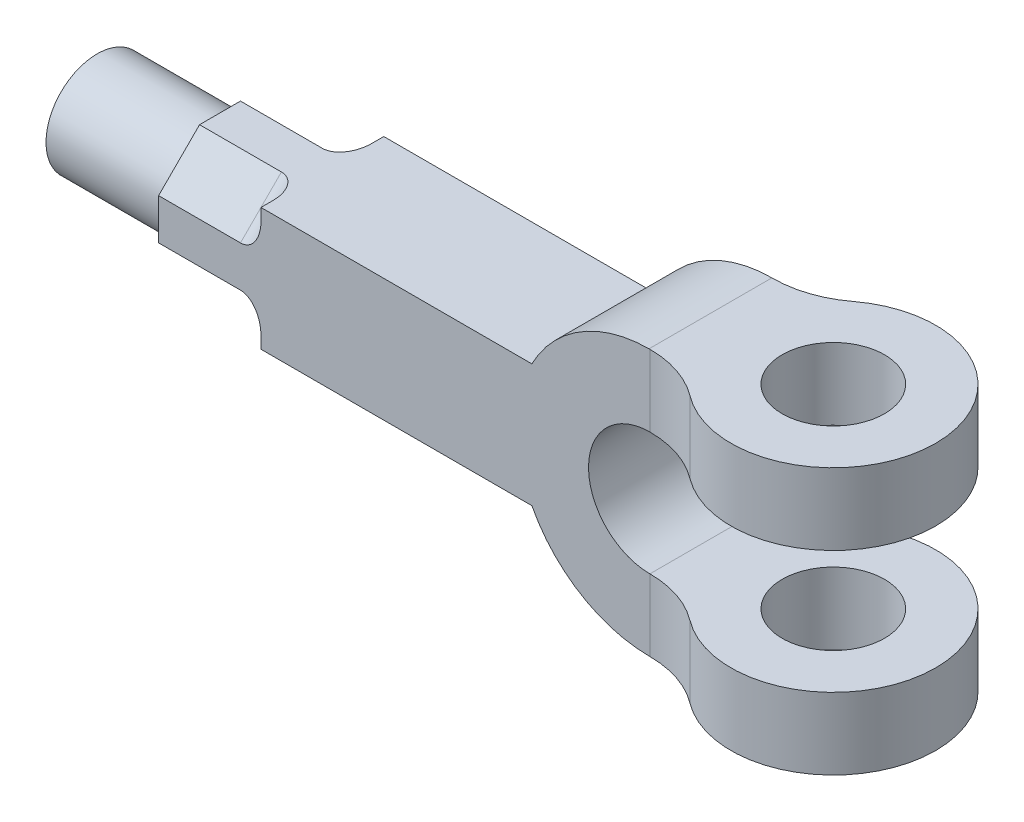
ISO-10303-21;
HEADER;
FILE_DESCRIPTION(('STEP AP214'),'2;1');
FILE_NAME('part.step','',(''),(''),'','','');
FILE_SCHEMA(('AUTOMOTIVE_DESIGN { 1 0 10303 214 1 1 1 1 }'));
ENDSEC;
DATA;
#1=APPLICATION_CONTEXT('core data for automotive mechanical design processes');
#2=APPLICATION_PROTOCOL_DEFINITION('international standard','automotive_design',2000,#1);
#3=PRODUCT_CONTEXT('',#1,'mechanical');
#4=PRODUCT('Part','Part','',(#3));
#5=PRODUCT_RELATED_PRODUCT_CATEGORY('part','',(#4));
#6=PRODUCT_DEFINITION_FORMATION('','',#4);
#7=PRODUCT_DEFINITION_CONTEXT('part definition',#1,'design');
#8=PRODUCT_DEFINITION('design','',#6,#7);
#9=PRODUCT_DEFINITION_SHAPE('','',#8);
#10=(LENGTH_UNIT() NAMED_UNIT(*) SI_UNIT(.MILLI.,.METRE.));
#11=(NAMED_UNIT(*) PLANE_ANGLE_UNIT() SI_UNIT($,.RADIAN.));
#12=(NAMED_UNIT(*) SI_UNIT($,.STERADIAN.) SOLID_ANGLE_UNIT());
#13=UNCERTAINTY_MEASURE_WITH_UNIT(LENGTH_MEASURE(1.E-05),#10,'distance_accuracy_value','');
#14=(GEOMETRIC_REPRESENTATION_CONTEXT(3) GLOBAL_UNCERTAINTY_ASSIGNED_CONTEXT((#13)) GLOBAL_UNIT_ASSIGNED_CONTEXT((#10,
#11,#12)) REPRESENTATION_CONTEXT('',''));
#15=CARTESIAN_POINT('',(0.,0.,0.));
#16=DIRECTION('',(0.,0.,1.));
#17=DIRECTION('',(1.,0.,0.));
#18=AXIS2_PLACEMENT_3D('',#15,#16,#17);
#19=CARTESIAN_POINT('',(-23.832750575626,14.,31.5));
#20=DIRECTION('',(0.,-1.,0.));
#21=DIRECTION('',(0.,0.,-1.));
#22=AXIS2_PLACEMENT_3D('',#19,#20,#21);
#23=CYLINDRICAL_SURFACE('',#22,19.5);
#24=CARTESIAN_POINT('',(-23.832750575626,0.,31.5));
#25=DIRECTION('',(0.,-1.,0.));
#26=DIRECTION('',(0.,0.,1.));
#27=AXIS2_PLACEMENT_3D('',#24,#25,#26);
#28=CIRCLE('',#27,19.5);
#29=CARTESIAN_POINT('',(-23.832750575626,0.,12.));
#30=VERTEX_POINT('',#29);
#31=CARTESIAN_POINT('',(-12.0672154813296,0.,15.9493670886076));
#32=VERTEX_POINT('',#31);
#33=EDGE_CURVE('E370',#30,#32,#28,.T.);
#34=ORIENTED_EDGE('',*,*,#33,.T.);
#35=DIRECTION('',(0.,-1.,0.));
#36=VECTOR('',#35,1.);
#37=CARTESIAN_POINT('',(-12.0672154813296,14.,15.9493670886076));
#38=LINE('',#37,#36);
#39=CARTESIAN_POINT('',(-12.0672154813296,14.,15.9493670886076));
#40=VERTEX_POINT('',#39);
#41=EDGE_CURVE('E406',#40,#32,#38,.T.);
#42=ORIENTED_EDGE('',*,*,#41,.F.);
#43=CARTESIAN_POINT('',(-23.832750575626,14.,31.5));
#44=DIRECTION('',(0.,-1.,0.));
#45=DIRECTION('',(0.,0.,1.));
#46=AXIS2_PLACEMENT_3D('',#43,#44,#45);
#47=CIRCLE('',#46,19.5);
#48=CARTESIAN_POINT('',(-23.832750575626,14.,12.));
#49=VERTEX_POINT('',#48);
#50=EDGE_CURVE('E371',#49,#40,#47,.T.);
#51=ORIENTED_EDGE('',*,*,#50,.F.);
#52=DIRECTION('',(0.,-1.,0.));
#53=VECTOR('',#52,1.);
#54=CARTESIAN_POINT('',(-23.832750575626,14.,12.));
#55=LINE('',#54,#53);
#56=EDGE_CURVE('E385',#49,#30,#55,.T.);
#57=ORIENTED_EDGE('',*,*,#56,.T.);
#58=EDGE_LOOP('',(#34,#42,#51,#57));
#59=FACE_BOUND('',#58,.T.);
#60=ADVANCED_FACE('F32',(#59),#23,.F.);
#61=CARTESIAN_POINT('',(0.,14.,0.));
#62=DIRECTION('',(0.,-1.,0.));
#63=DIRECTION('',(0.,0.,-1.));
#64=AXIS2_PLACEMENT_3D('',#61,#62,#63);
#65=CYLINDRICAL_SURFACE('',#64,20.);
#66=CARTESIAN_POINT('',(0.,0.,0.));
#67=DIRECTION('',(0.,1.,0.));
#68=DIRECTION('',(0.,0.,1.));
#69=AXIS2_PLACEMENT_3D('',#66,#67,#68);
#70=CIRCLE('',#69,20.);
#71=CARTESIAN_POINT('',(-12.0672154813296,0.,-15.9493670886076));
#72=VERTEX_POINT('',#71);
#73=EDGE_CURVE('E388',#32,#72,#70,.T.);
#74=ORIENTED_EDGE('',*,*,#73,.T.);
#75=DIRECTION('',(0.,-1.,0.));
#76=VECTOR('',#75,1.);
#77=CARTESIAN_POINT('',(-12.0672154813296,14.,-15.9493670886076));
#78=LINE('',#77,#76);
#79=CARTESIAN_POINT('',(-12.0672154813296,14.,-15.9493670886076));
#80=VERTEX_POINT('',#79);
#81=EDGE_CURVE('E403',#80,#72,#78,.T.);
#82=ORIENTED_EDGE('',*,*,#81,.F.);
#83=CARTESIAN_POINT('',(0.,14.,0.));
#84=DIRECTION('',(0.,1.,0.));
#85=DIRECTION('',(0.,0.,1.));
#86=AXIS2_PLACEMENT_3D('',#83,#84,#85);
#87=CIRCLE('',#86,20.);
#88=EDGE_CURVE('E374',#40,#80,#87,.T.);
#89=ORIENTED_EDGE('',*,*,#88,.F.);
#90=ORIENTED_EDGE('',*,*,#41,.T.);
#91=EDGE_LOOP('',(#74,#82,#89,#90));
#92=FACE_BOUND('',#91,.T.);
#93=ADVANCED_FACE('F542',(#92),#65,.T.);
#94=CARTESIAN_POINT('',(-23.832750575626,14.,-31.5));
#95=DIRECTION('',(0.,-1.,0.));
#96=DIRECTION('',(0.,0.,-1.));
#97=AXIS2_PLACEMENT_3D('',#94,#95,#96);
#98=CYLINDRICAL_SURFACE('',#97,19.5);
#99=CARTESIAN_POINT('',(-23.832750575626,0.,-31.5));
#100=DIRECTION('',(0.,-1.,0.));
#101=DIRECTION('',(0.,0.,-1.));
#102=AXIS2_PLACEMENT_3D('',#99,#100,#101);
#103=CIRCLE('',#102,19.5);
#104=CARTESIAN_POINT('',(-23.832750575626,0.,-12.));
#105=VERTEX_POINT('',#104);
#106=EDGE_CURVE('E375',#72,#105,#103,.T.);
#107=ORIENTED_EDGE('',*,*,#106,.T.);
#108=DIRECTION('',(0.,-1.,0.));
#109=VECTOR('',#108,1.);
#110=CARTESIAN_POINT('',(-23.832750575626,14.,-12.));
#111=LINE('',#110,#109);
#112=CARTESIAN_POINT('',(-23.832750575626,14.,-12.));
#113=VERTEX_POINT('',#112);
#114=EDGE_CURVE('E400',#113,#105,#111,.T.);
#115=ORIENTED_EDGE('',*,*,#114,.F.);
#116=CARTESIAN_POINT('',(-23.832750575626,14.,-31.5));
#117=DIRECTION('',(0.,-1.,0.));
#118=DIRECTION('',(0.,0.,-1.));
#119=AXIS2_PLACEMENT_3D('',#116,#117,#118);
#120=CIRCLE('',#119,19.5);
#121=EDGE_CURVE('E377',#80,#113,#120,.T.);
#122=ORIENTED_EDGE('',*,*,#121,.F.);
#123=ORIENTED_EDGE('',*,*,#81,.T.);
#124=EDGE_LOOP('',(#107,#115,#122,#123));
#125=FACE_BOUND('',#124,.T.);
#126=ADVANCED_FACE('F498',(#125),#98,.F.);
#127=CARTESIAN_POINT('',(-24.,14.,-12.));
#128=DIRECTION('',(0.,0.,1.));
#129=DIRECTION('',(1.,0.,0.));
#130=AXIS2_PLACEMENT_3D('',#127,#128,#129);
#131=PLANE('',#130);
#132=DIRECTION('',(0.,1.,0.));
#133=VECTOR('',#132,1.);
#134=CARTESIAN_POINT('',(-24.,-38.,-12.));
#135=LINE('',#134,#133);
#136=CARTESIAN_POINT('',(-24.,-38.,-12.));
#137=VERTEX_POINT('',#136);
#138=CARTESIAN_POINT('',(-24.,-37.9994620642437,-12.));
#139=VERTEX_POINT('',#138);
#140=EDGE_CURVE('E224',#137,#139,#135,.T.);
#141=ORIENTED_EDGE('',*,*,#140,.T.);
#142=CARTESIAN_POINT('',(-23.832750575626,-12.,-12.));
#143=DIRECTION('',(0.,0.,1.));
#144=DIRECTION('',(1.,0.,0.));
#145=AXIS2_PLACEMENT_3D('',#142,#143,#144);
#146=CIRCLE('',#145,26.);
#147=CARTESIAN_POINT('',(-46.8978757649676,-24.,-12.));
#148=VERTEX_POINT('',#147);
#149=EDGE_CURVE('E48',#148,#139,#146,.T.);
#150=ORIENTED_EDGE('',*,*,#149,.F.);
#151=DIRECTION('',(1.,0.,0.));
#152=VECTOR('',#151,1.);
#153=CARTESIAN_POINT('',(-46.8978757649676,-24.,-12.));
#154=LINE('',#153,#152);
#155=CARTESIAN_POINT('',(-99.832750575626,-23.9999999999998,-11.9999999999999));
#156=VERTEX_POINT('',#155);
#157=EDGE_CURVE('E343',#156,#148,#154,.T.);
#158=ORIENTED_EDGE('',*,*,#157,.F.);
#159=DIRECTION('',(0.,-1.,0.));
#160=VECTOR('',#159,1.);
#161=CARTESIAN_POINT('',(-99.832750575626,-23.9999999999998,-11.9999999999999));
#162=LINE('',#161,#160);
#163=CARTESIAN_POINT('',(-99.832750575626,-21.6568542494921,-11.9999999999999));
#164=VERTEX_POINT('',#163);
#165=EDGE_CURVE('E300',#164,#156,#162,.T.);
#166=ORIENTED_EDGE('',*,*,#165,.F.);
#167=CARTESIAN_POINT('',(-103.832750575626,-21.656854249492,-12.));
#168=DIRECTION('',(0.,0.,1.));
#169=DIRECTION('',(0.,1.,0.));
#170=AXIS2_PLACEMENT_3D('',#167,#168,#169);
#171=ELLIPSE('',#170,5.65685424949244,4.);
#172=CARTESIAN_POINT('',(-103.832750575626,-15.9999999999998,-11.9999999999998));
#173=VERTEX_POINT('',#172);
#174=EDGE_CURVE('E437',#164,#173,#171,.T.);
#175=ORIENTED_EDGE('',*,*,#174,.T.);
#176=DIRECTION('',(-1.,0.,0.));
#177=VECTOR('',#176,1.);
#178=CARTESIAN_POINT('',(-99.832750575626,-15.9999999999998,-11.9999999999998));
#179=LINE('',#178,#177);
#180=CARTESIAN_POINT('',(-119.832750575626,-15.9999999999998,-11.9999999999998));
#181=VERTEX_POINT('',#180);
#182=EDGE_CURVE('E294',#173,#181,#179,.T.);
#183=ORIENTED_EDGE('',*,*,#182,.T.);
#184=DIRECTION('',(0.,-1.,0.));
#185=VECTOR('',#184,1.);
#186=CARTESIAN_POINT('',(-119.832750575626,-24.,-12.));
#187=LINE('',#186,#185);
#188=CARTESIAN_POINT('',(-119.832750575626,-8.00000000000001,-12.));
#189=VERTEX_POINT('',#188);
#190=EDGE_CURVE('E340',#189,#181,#187,.T.);
#191=ORIENTED_EDGE('',*,*,#190,.F.);
#192=DIRECTION('',(-1.,0.,0.));
#193=VECTOR('',#192,1.);
#194=CARTESIAN_POINT('',(-99.832750575626,-8.00000000000001,-12.));
#195=LINE('',#194,#193);
#196=CARTESIAN_POINT('',(-103.832750575626,-8.00000000000001,-12.));
#197=VERTEX_POINT('',#196);
#198=EDGE_CURVE('E312',#197,#189,#195,.T.);
#199=ORIENTED_EDGE('',*,*,#198,.F.);
#200=CARTESIAN_POINT('',(-103.832750575626,-2.34314575050762,-12.));
#201=DIRECTION('',(0.,0.,1.));
#202=DIRECTION('',(0.,1.,0.));
#203=AXIS2_PLACEMENT_3D('',#200,#201,#202);
#204=ELLIPSE('',#203,5.65685424949238,4.);
#205=CARTESIAN_POINT('',(-99.832750575626,-2.34314575050763,-12.));
#206=VERTEX_POINT('',#205);
#207=EDGE_CURVE('E270',#197,#206,#204,.T.);
#208=ORIENTED_EDGE('',*,*,#207,.T.);
#209=DIRECTION('',(0.,-1.,0.));
#210=VECTOR('',#209,1.);
#211=CARTESIAN_POINT('',(-99.832750575626,0.,-12.));
#212=LINE('',#211,#210);
#213=CARTESIAN_POINT('',(-99.832750575626,0.,-12.));
#214=VERTEX_POINT('',#213);
#215=EDGE_CURVE('E307',#214,#206,#212,.T.);
#216=ORIENTED_EDGE('',*,*,#215,.F.);
#217=DIRECTION('',(-1.,0.,0.));
#218=VECTOR('',#217,1.);
#219=CARTESIAN_POINT('',(-46.8978757649676,0.,-12.));
#220=LINE('',#219,#218);
#221=CARTESIAN_POINT('',(-46.8978757649676,0.,-12.));
#222=VERTEX_POINT('',#221);
#223=EDGE_CURVE('E337',#222,#214,#220,.T.);
#224=ORIENTED_EDGE('',*,*,#223,.F.);
#225=CARTESIAN_POINT('',(-23.832750575626,-12.,-12.));
#226=DIRECTION('',(0.,0.,1.));
#227=DIRECTION('',(1.,0.,0.));
#228=AXIS2_PLACEMENT_3D('',#225,#226,#227);
#229=CIRCLE('',#228,26.);
#230=CARTESIAN_POINT('',(-24.,13.9994620642437,-12.));
#231=VERTEX_POINT('',#230);
#232=EDGE_CURVE('E335',#231,#222,#229,.T.);
#233=ORIENTED_EDGE('',*,*,#232,.F.);
#234=DIRECTION('',(0.,-1.,0.));
#235=VECTOR('',#234,1.);
#236=CARTESIAN_POINT('',(-24.,14.,-12.));
#237=LINE('',#236,#235);
#238=CARTESIAN_POINT('',(-24.,14.,-12.));
#239=VERTEX_POINT('',#238);
#240=EDGE_CURVE('E397',#239,#231,#237,.T.);
#241=ORIENTED_EDGE('',*,*,#240,.F.);
#242=DIRECTION('',(-1.,0.,0.));
#243=VECTOR('',#242,1.);
#244=CARTESIAN_POINT('',(-24.,14.,-12.));
#245=LINE('',#244,#243);
#246=EDGE_CURVE('E379',#113,#239,#245,.T.);
#247=ORIENTED_EDGE('',*,*,#246,.F.);
#248=ORIENTED_EDGE('',*,*,#114,.T.);
#249=CARTESIAN_POINT('',(-23.832750575626,-12.,-12.));
#250=DIRECTION('',(0.,0.,-1.));
#251=DIRECTION('',(1.,0.,0.));
#252=AXIS2_PLACEMENT_3D('',#249,#250,#251);
#253=CIRCLE('',#252,12.);
#254=CARTESIAN_POINT('',(-23.832750575626,-24.,-12.));
#255=VERTEX_POINT('',#254);
#256=EDGE_CURVE('E333',#255,#105,#253,.T.);
#257=ORIENTED_EDGE('',*,*,#256,.F.);
#258=DIRECTION('',(0.,1.,0.));
#259=VECTOR('',#258,1.);
#260=CARTESIAN_POINT('',(-23.832750575626,-24.,-12.));
#261=LINE('',#260,#259);
#262=CARTESIAN_POINT('',(-23.832750575626,-38.,-12.));
#263=VERTEX_POINT('',#262);
#264=EDGE_CURVE('E346',#263,#255,#261,.T.);
#265=ORIENTED_EDGE('',*,*,#264,.F.);
#266=DIRECTION('',(-1.,0.,0.));
#267=VECTOR('',#266,1.);
#268=CARTESIAN_POINT('',(-24.,-38.,-12.));
#269=LINE('',#268,#267);
#270=EDGE_CURVE('E239',#263,#137,#269,.T.);
#271=ORIENTED_EDGE('',*,*,#270,.T.);
#272=EDGE_LOOP('',(#141,#150,#158,#166,#175,#183,#191,#199,#208,#216,#224,#233,#241,#247,#248,
#257,#265,#271));
#273=FACE_BOUND('',#272,.T.);
#274=ADVANCED_FACE('F447',(#273),#131,.F.);
#275=CARTESIAN_POINT('',(-24.,14.,-12.));
#276=DIRECTION('',(1.,0.,0.));
#277=DIRECTION('',(0.,0.,-1.));
#278=AXIS2_PLACEMENT_3D('',#275,#276,#277);
#279=PLANE('',#278);
#280=ORIENTED_EDGE('',*,*,#240,.T.);
#281=DIRECTION('',(0.,0.,1.));
#282=VECTOR('',#281,1.);
#283=CARTESIAN_POINT('',(-24.,13.9994620642437,-12.));
#284=LINE('',#283,#282);
#285=CARTESIAN_POINT('',(-24.,13.9994620642437,12.));
#286=VERTEX_POINT('',#285);
#287=EDGE_CURVE('E353',#231,#286,#284,.T.);
#288=ORIENTED_EDGE('',*,*,#287,.T.);
#289=DIRECTION('',(0.,-1.,0.));
#290=VECTOR('',#289,1.);
#291=CARTESIAN_POINT('',(-24.,14.,12.));
#292=LINE('',#291,#290);
#293=CARTESIAN_POINT('',(-24.,14.,12.));
#294=VERTEX_POINT('',#293);
#295=EDGE_CURVE('E394',#294,#286,#292,.T.);
#296=ORIENTED_EDGE('',*,*,#295,.F.);
#297=DIRECTION('',(0.,0.,1.));
#298=VECTOR('',#297,1.);
#299=CARTESIAN_POINT('',(-24.,14.,-12.));
#300=LINE('',#299,#298);
#301=EDGE_CURVE('E381',#239,#294,#300,.T.);
#302=ORIENTED_EDGE('',*,*,#301,.F.);
#303=EDGE_LOOP('',(#280,#288,#296,#302));
#304=FACE_BOUND('',#303,.T.);
#305=ADVANCED_FACE('F488',(#304),#279,.F.);
#306=CARTESIAN_POINT('',(-24.,14.,12.));
#307=DIRECTION('',(0.,0.,-1.));
#308=DIRECTION('',(-1.,0.,0.));
#309=AXIS2_PLACEMENT_3D('',#306,#307,#308);
#310=PLANE('',#309);
#311=CARTESIAN_POINT('',(-23.832750575626,-12.,12.));
#312=DIRECTION('',(0.,0.,1.));
#313=DIRECTION('',(1.,0.,0.));
#314=AXIS2_PLACEMENT_3D('',#311,#312,#313);
#315=CIRCLE('',#314,26.);
#316=CARTESIAN_POINT('',(-46.8978757649676,-24.,12.));
#317=VERTEX_POINT('',#316);
#318=CARTESIAN_POINT('',(-24.,-37.9994620642437,12.));
#319=VERTEX_POINT('',#318);
#320=EDGE_CURVE('E220',#317,#319,#315,.T.);
#321=ORIENTED_EDGE('',*,*,#320,.T.);
#322=DIRECTION('',(0.,1.,0.));
#323=VECTOR('',#322,1.);
#324=CARTESIAN_POINT('',(-24.,-38.,12.));
#325=LINE('',#324,#323);
#326=CARTESIAN_POINT('',(-24.,-38.,12.));
#327=VERTEX_POINT('',#326);
#328=EDGE_CURVE('E216',#327,#319,#325,.T.);
#329=ORIENTED_EDGE('',*,*,#328,.F.);
#330=DIRECTION('',(1.,0.,0.));
#331=VECTOR('',#330,1.);
#332=CARTESIAN_POINT('',(-24.,-38.,12.));
#333=LINE('',#332,#331);
#334=CARTESIAN_POINT('',(-23.832750575626,-38.,12.));
#335=VERTEX_POINT('',#334);
#336=EDGE_CURVE('E219',#327,#335,#333,.T.);
#337=ORIENTED_EDGE('',*,*,#336,.T.);
#338=DIRECTION('',(0.,1.,0.));
#339=VECTOR('',#338,1.);
#340=CARTESIAN_POINT('',(-23.832750575626,-24.,12.));
#341=LINE('',#340,#339);
#342=CARTESIAN_POINT('',(-23.832750575626,-24.,12.));
#343=VERTEX_POINT('',#342);
#344=EDGE_CURVE('E331',#335,#343,#341,.T.);
#345=ORIENTED_EDGE('',*,*,#344,.T.);
#346=CARTESIAN_POINT('',(-23.832750575626,-12.,12.));
#347=DIRECTION('',(0.,0.,-1.));
#348=DIRECTION('',(1.,0.,0.));
#349=AXIS2_PLACEMENT_3D('',#346,#347,#348);
#350=CIRCLE('',#349,12.);
#351=EDGE_CURVE('E317',#343,#30,#350,.T.);
#352=ORIENTED_EDGE('',*,*,#351,.T.);
#353=ORIENTED_EDGE('',*,*,#56,.F.);
#354=DIRECTION('',(1.,0.,0.));
#355=VECTOR('',#354,1.);
#356=CARTESIAN_POINT('',(-24.,14.,12.));
#357=LINE('',#356,#355);
#358=EDGE_CURVE('E383',#294,#49,#357,.T.);
#359=ORIENTED_EDGE('',*,*,#358,.F.);
#360=ORIENTED_EDGE('',*,*,#295,.T.);
#361=CARTESIAN_POINT('',(-23.832750575626,-12.,12.));
#362=DIRECTION('',(0.,0.,1.));
#363=DIRECTION('',(1.,0.,0.));
#364=AXIS2_PLACEMENT_3D('',#361,#362,#363);
#365=CIRCLE('',#364,26.);
#366=CARTESIAN_POINT('',(-46.8978757649676,0.,12.));
#367=VERTEX_POINT('',#366);
#368=EDGE_CURVE('E320',#286,#367,#365,.T.);
#369=ORIENTED_EDGE('',*,*,#368,.T.);
#370=DIRECTION('',(-1.,0.,0.));
#371=VECTOR('',#370,1.);
#372=CARTESIAN_POINT('',(-46.8978757649676,0.,12.));
#373=LINE('',#372,#371);
#374=CARTESIAN_POINT('',(-99.832750575626,0.,12.));
#375=VERTEX_POINT('',#374);
#376=EDGE_CURVE('E322',#367,#375,#373,.T.);
#377=ORIENTED_EDGE('',*,*,#376,.T.);
#378=DIRECTION('',(0.,1.,0.));
#379=VECTOR('',#378,1.);
#380=CARTESIAN_POINT('',(-99.832750575626,1.96023752785379E-13,11.9999999999999));
#381=LINE('',#380,#379);
#382=CARTESIAN_POINT('',(-99.832750575626,-2.34314575050742,11.9999999999999));
#383=VERTEX_POINT('',#382);
#384=EDGE_CURVE('E274',#383,#375,#381,.T.);
#385=ORIENTED_EDGE('',*,*,#384,.F.);
#386=CARTESIAN_POINT('',(-103.832750575626,-2.34314575050752,12.));
#387=DIRECTION('',(0.,0.,-1.));
#388=DIRECTION('',(0.,-1.,0.));
#389=AXIS2_PLACEMENT_3D('',#386,#387,#388);
#390=ELLIPSE('',#389,5.6568542494924,4.);
#391=CARTESIAN_POINT('',(-103.832750575626,-7.9999999999998,11.9999999999999));
#392=VERTEX_POINT('',#391);
#393=EDGE_CURVE('E429',#383,#392,#390,.T.);
#394=ORIENTED_EDGE('',*,*,#393,.T.);
#395=DIRECTION('',(-1.,0.,0.));
#396=VECTOR('',#395,1.);
#397=CARTESIAN_POINT('',(-99.832750575626,-7.9999999999998,11.9999999999999));
#398=LINE('',#397,#396);
#399=CARTESIAN_POINT('',(-119.832750575626,-7.9999999999998,11.9999999999999));
#400=VERTEX_POINT('',#399);
#401=EDGE_CURVE('E281',#392,#400,#398,.T.);
#402=ORIENTED_EDGE('',*,*,#401,.T.);
#403=DIRECTION('',(0.,-1.,0.));
#404=VECTOR('',#403,1.);
#405=CARTESIAN_POINT('',(-119.832750575626,-24.,12.));
#406=LINE('',#405,#404);
#407=CARTESIAN_POINT('',(-119.832750575626,-15.9999999999998,12.));
#408=VERTEX_POINT('',#407);
#409=EDGE_CURVE('E325',#400,#408,#406,.T.);
#410=ORIENTED_EDGE('',*,*,#409,.T.);
#411=DIRECTION('',(-1.,0.,0.));
#412=VECTOR('',#411,1.);
#413=CARTESIAN_POINT('',(-99.832750575626,-15.9999999999997,12.0000000000001));
#414=LINE('',#413,#412);
#415=CARTESIAN_POINT('',(-103.832750575626,-15.9999999999997,12.0000000000001));
#416=VERTEX_POINT('',#415);
#417=EDGE_CURVE('E291',#416,#408,#414,.T.);
#418=ORIENTED_EDGE('',*,*,#417,.F.);
#419=CARTESIAN_POINT('',(-103.832750575626,-21.6568542494921,12.));
#420=DIRECTION('',(0.,0.,-1.));
#421=DIRECTION('',(0.,-1.,0.));
#422=AXIS2_PLACEMENT_3D('',#419,#420,#421);
#423=ELLIPSE('',#422,5.65685424949234,4.);
#424=CARTESIAN_POINT('',(-99.832750575626,-21.6568542494921,12.));
#425=VERTEX_POINT('',#424);
#426=EDGE_CURVE('E435',#416,#425,#423,.T.);
#427=ORIENTED_EDGE('',*,*,#426,.T.);
#428=DIRECTION('',(0.,1.,0.));
#429=VECTOR('',#428,1.);
#430=CARTESIAN_POINT('',(-99.832750575626,-23.9999999999997,12.));
#431=LINE('',#430,#429);
#432=CARTESIAN_POINT('',(-99.832750575626,-23.9999999999997,12.));
#433=VERTEX_POINT('',#432);
#434=EDGE_CURVE('E285',#433,#425,#431,.T.);
#435=ORIENTED_EDGE('',*,*,#434,.F.);
#436=DIRECTION('',(1.,0.,0.));
#437=VECTOR('',#436,1.);
#438=CARTESIAN_POINT('',(-46.8978757649676,-24.,12.));
#439=LINE('',#438,#437);
#440=EDGE_CURVE('E328',#433,#317,#439,.T.);
#441=ORIENTED_EDGE('',*,*,#440,.T.);
#442=EDGE_LOOP('',(#321,#329,#337,#345,#352,#353,#359,#360,#369,#377,#385,#394,#402,#410,#418,
#427,#435,#441));
#443=FACE_BOUND('',#442,.T.);
#444=ADVANCED_FACE('F218',(#443),#310,.F.);
#445=CARTESIAN_POINT('',(-23.832750575626,14.,31.5));
#446=DIRECTION('',(0.,1.,0.));
#447=DIRECTION('',(0.,0.,1.));
#448=AXIS2_PLACEMENT_3D('',#445,#446,#447);
#449=PLANE('',#448);
#450=CARTESIAN_POINT('',(0.,14.,0.));
#451=DIRECTION('',(0.,1.,0.));
#452=DIRECTION('',(0.,0.,1.));
#453=AXIS2_PLACEMENT_3D('',#450,#451,#452);
#454=CIRCLE('',#453,10.);
#455=CARTESIAN_POINT('',(0.,14.,10.));
#456=VERTEX_POINT('',#455);
#457=EDGE_CURVE('E882',#456,#456,#454,.T.);
#458=ORIENTED_EDGE('',*,*,#457,.F.);
#459=EDGE_LOOP('',(#458));
#460=FACE_BOUND('',#459,.T.);
#461=ORIENTED_EDGE('',*,*,#121,.T.);
#462=ORIENTED_EDGE('',*,*,#246,.T.);
#463=ORIENTED_EDGE('',*,*,#301,.T.);
#464=ORIENTED_EDGE('',*,*,#358,.T.);
#465=ORIENTED_EDGE('',*,*,#50,.T.);
#466=ORIENTED_EDGE('',*,*,#88,.T.);
#467=EDGE_LOOP('',(#461,#462,#463,#464,#465,#466));
#468=FACE_BOUND('',#467,.T.);
#469=ADVANCED_FACE('F492',(#460,#468),#449,.T.);
#470=CARTESIAN_POINT('',(-23.832750575626,0.,31.5));
#471=DIRECTION('',(0.,1.,0.));
#472=DIRECTION('',(0.,0.,1.));
#473=AXIS2_PLACEMENT_3D('',#470,#471,#472);
#474=PLANE('',#473);
#475=CARTESIAN_POINT('',(0.,0.,0.));
#476=DIRECTION('',(0.,1.,0.));
#477=DIRECTION('',(0.,0.,1.));
#478=AXIS2_PLACEMENT_3D('',#475,#476,#477);
#479=CIRCLE('',#478,10.);
#480=CARTESIAN_POINT('',(0.,0.,10.));
#481=VERTEX_POINT('',#480);
#482=EDGE_CURVE('E255',#481,#481,#479,.T.);
#483=ORIENTED_EDGE('',*,*,#482,.T.);
#484=EDGE_LOOP('',(#483));
#485=FACE_BOUND('',#484,.T.);
#486=ORIENTED_EDGE('',*,*,#33,.F.);
#487=DIRECTION('',(0.,0.,1.));
#488=VECTOR('',#487,1.);
#489=CARTESIAN_POINT('',(-23.832750575626,0.,-12.));
#490=LINE('',#489,#488);
#491=EDGE_CURVE('E349',#105,#30,#490,.T.);
#492=ORIENTED_EDGE('',*,*,#491,.F.);
#493=ORIENTED_EDGE('',*,*,#106,.F.);
#494=ORIENTED_EDGE('',*,*,#73,.F.);
#495=EDGE_LOOP('',(#486,#492,#493,#494));
#496=FACE_BOUND('',#495,.T.);
#497=ADVANCED_FACE('F504',(#485,#496),#474,.F.);
#498=CARTESIAN_POINT('',(-23.832750575626,-12.,-12.));
#499=DIRECTION('',(0.,0.,1.));
#500=DIRECTION('',(1.,0.,0.));
#501=AXIS2_PLACEMENT_3D('',#498,#499,#500);
#502=CYLINDRICAL_SURFACE('',#501,26.);
#503=ORIENTED_EDGE('',*,*,#287,.F.);
#504=ORIENTED_EDGE('',*,*,#232,.T.);
#505=DIRECTION('',(0.,0.,1.));
#506=VECTOR('',#505,1.);
#507=CARTESIAN_POINT('',(-46.8978757649676,0.,-12.));
#508=LINE('',#507,#506);
#509=EDGE_CURVE('E363',#222,#367,#508,.T.);
#510=ORIENTED_EDGE('',*,*,#509,.T.);
#511=ORIENTED_EDGE('',*,*,#368,.F.);
#512=EDGE_LOOP('',(#503,#504,#510,#511));
#513=FACE_BOUND('',#512,.T.);
#514=ADVANCED_FACE('F538',(#513),#502,.T.);
#515=CARTESIAN_POINT('',(-23.832750575626,-12.,-12.));
#516=DIRECTION('',(0.,0.,1.));
#517=DIRECTION('',(1.,0.,0.));
#518=AXIS2_PLACEMENT_3D('',#515,#516,#517);
#519=CYLINDRICAL_SURFACE('',#518,12.);
#520=ORIENTED_EDGE('',*,*,#491,.T.);
#521=ORIENTED_EDGE('',*,*,#351,.F.);
#522=DIRECTION('',(0.,0.,1.));
#523=VECTOR('',#522,1.);
#524=CARTESIAN_POINT('',(-23.832750575626,-24.,-12.));
#525=LINE('',#524,#523);
#526=EDGE_CURVE('E350',#255,#343,#525,.T.);
#527=ORIENTED_EDGE('',*,*,#526,.F.);
#528=ORIENTED_EDGE('',*,*,#256,.T.);
#529=EDGE_LOOP('',(#520,#521,#527,#528));
#530=FACE_BOUND('',#529,.T.);
#531=ADVANCED_FACE('F507',(#530),#519,.F.);
#532=CARTESIAN_POINT('',(-23.832750575626,-12.,-12.));
#533=DIRECTION('',(0.,0.,1.));
#534=DIRECTION('',(1.,0.,0.));
#535=AXIS2_PLACEMENT_3D('',#532,#533,#534);
#536=CYLINDRICAL_SURFACE('',#535,26.);
#537=DIRECTION('',(0.,0.,1.));
#538=VECTOR('',#537,1.);
#539=CARTESIAN_POINT('',(-24.,-37.9994620642437,-12.));
#540=LINE('',#539,#538);
#541=EDGE_CURVE('E11',#319,#139,#540,.F.);
#542=ORIENTED_EDGE('',*,*,#541,.F.);
#543=ORIENTED_EDGE('',*,*,#320,.F.);
#544=DIRECTION('',(0.,0.,1.));
#545=VECTOR('',#544,1.);
#546=CARTESIAN_POINT('',(-46.8978757649676,-24.,-12.));
#547=LINE('',#546,#545);
#548=EDGE_CURVE('E354',#148,#317,#547,.T.);
#549=ORIENTED_EDGE('',*,*,#548,.F.);
#550=ORIENTED_EDGE('',*,*,#149,.T.);
#551=EDGE_LOOP('',(#542,#543,#549,#550));
#552=FACE_BOUND('',#551,.T.);
#553=ADVANCED_FACE('F530',(#552),#536,.T.);
#554=CARTESIAN_POINT('',(-46.8978757649676,-24.,-12.));
#555=DIRECTION('',(0.,-1.,0.));
#556=DIRECTION('',(0.,0.,-1.));
#557=AXIS2_PLACEMENT_3D('',#554,#555,#556);
#558=PLANE('',#557);
#559=DIRECTION('',(-1.,0.,0.));
#560=VECTOR('',#559,1.);
#561=CARTESIAN_POINT('',(-99.832750575626,-23.9999999999998,-3.99999999999988));
#562=LINE('',#561,#560);
#563=CARTESIAN_POINT('',(-103.832750575626,-23.9999999999998,-3.99999999999988));
#564=VERTEX_POINT('',#563);
#565=CARTESIAN_POINT('',(-119.832750575626,-24.,-3.99999999999971));
#566=VERTEX_POINT('',#565);
#567=EDGE_CURVE('E302',#564,#566,#562,.T.);
#568=ORIENTED_EDGE('',*,*,#567,.F.);
#569=CARTESIAN_POINT('',(-103.832750575626,-24.,-9.65685424949203));
#570=DIRECTION('',(0.,-1.,0.));
#571=DIRECTION('',(0.,0.,-1.));
#572=AXIS2_PLACEMENT_3D('',#569,#570,#571);
#573=ELLIPSE('',#572,5.65685424949232,4.);
#574=CARTESIAN_POINT('',(-99.832750575626,-23.9999999999998,-9.65685424949226));
#575=VERTEX_POINT('',#574);
#576=EDGE_CURVE('E439',#564,#575,#573,.F.);
#577=ORIENTED_EDGE('',*,*,#576,.T.);
#578=DIRECTION('',(0.,0.,1.));
#579=VECTOR('',#578,1.);
#580=CARTESIAN_POINT('',(-99.832750575626,-23.9999999999998,-11.9999999999999));
#581=LINE('',#580,#579);
#582=EDGE_CURVE('E297',#156,#575,#581,.T.);
#583=ORIENTED_EDGE('',*,*,#582,.F.);
#584=ORIENTED_EDGE('',*,*,#157,.T.);
#585=ORIENTED_EDGE('',*,*,#548,.T.);
#586=ORIENTED_EDGE('',*,*,#440,.F.);
#587=DIRECTION('',(0.,0.,1.));
#588=VECTOR('',#587,1.);
#589=CARTESIAN_POINT('',(-99.832750575626,-23.9999999999997,12.));
#590=LINE('',#589,#588);
#591=CARTESIAN_POINT('',(-99.832750575626,-23.9999999999997,9.65685424949241));
#592=VERTEX_POINT('',#591);
#593=EDGE_CURVE('E288',#592,#433,#590,.T.);
#594=ORIENTED_EDGE('',*,*,#593,.F.);
#595=CARTESIAN_POINT('',(-103.832750575626,-24.,9.65685424949211));
#596=DIRECTION('',(0.,-1.,0.));
#597=DIRECTION('',(0.,0.,-1.));
#598=AXIS2_PLACEMENT_3D('',#595,#596,#597);
#599=ELLIPSE('',#598,5.65685424949242,4.);
#600=CARTESIAN_POINT('',(-103.832750575626,-23.9999999999997,4.00000000000003));
#601=VERTEX_POINT('',#600);
#602=EDGE_CURVE('E433',#592,#601,#599,.F.);
#603=ORIENTED_EDGE('',*,*,#602,.T.);
#604=DIRECTION('',(-1.,0.,0.));
#605=VECTOR('',#604,1.);
#606=CARTESIAN_POINT('',(-99.832750575626,-23.9999999999997,4.00000000000003));
#607=LINE('',#606,#605);
#608=CARTESIAN_POINT('',(-119.832750575626,-23.9999999999997,4.00000000000003));
#609=VERTEX_POINT('',#608);
#610=EDGE_CURVE('E280',#601,#609,#607,.T.);
#611=ORIENTED_EDGE('',*,*,#610,.T.);
#612=DIRECTION('',(0.,0.,1.));
#613=VECTOR('',#612,1.);
#614=CARTESIAN_POINT('',(-119.832750575626,-24.,-12.));
#615=LINE('',#614,#613);
#616=EDGE_CURVE('E357',#566,#609,#615,.T.);
#617=ORIENTED_EDGE('',*,*,#616,.F.);
#618=EDGE_LOOP('',(#568,#577,#583,#584,#585,#586,#594,#603,#611,#617));
#619=FACE_BOUND('',#618,.T.);
#620=ADVANCED_FACE('F528',(#619),#558,.T.);
#621=CARTESIAN_POINT('',(-119.832750575626,-24.,-12.));
#622=DIRECTION('',(-1.,0.,0.));
#623=DIRECTION('',(0.,0.,1.));
#624=AXIS2_PLACEMENT_3D('',#621,#622,#623);
#625=PLANE('',#624);
#626=CARTESIAN_POINT('',(-119.832750575626,-11.9999999999995,0.));
#627=DIRECTION('',(-1.,0.,0.));
#628=DIRECTION('',(0.,0.,1.));
#629=AXIS2_PLACEMENT_3D('',#626,#627,#628);
#630=CIRCLE('',#629,10.);
#631=CARTESIAN_POINT('',(-119.832750575626,-11.9999999999995,9.99999999999995));
#632=VERTEX_POINT('',#631);
#633=EDGE_CURVE('E41',#632,#632,#630,.T.);
#634=ORIENTED_EDGE('',*,*,#633,.F.);
#635=EDGE_LOOP('',(#634));
#636=FACE_BOUND('',#635,.T.);
#637=DIRECTION('',(0.,0.707106781186555,-0.707106781186541));
#638=VECTOR('',#637,1.);
#639=CARTESIAN_POINT('',(-119.832750575626,-23.9999999999998,-3.99999999999988));
#640=LINE('',#639,#638);
#641=EDGE_CURVE('E267',#566,#181,#640,.T.);
#642=ORIENTED_EDGE('',*,*,#641,.F.);
#643=ORIENTED_EDGE('',*,*,#616,.T.);
#644=DIRECTION('',(0.,-0.707106781186543,-0.707106781186552));
#645=VECTOR('',#644,1.);
#646=CARTESIAN_POINT('',(-119.832750575626,-15.9999999999997,12.0000000000001));
#647=LINE('',#646,#645);
#648=EDGE_CURVE('E289',#408,#609,#647,.T.);
#649=ORIENTED_EDGE('',*,*,#648,.F.);
#650=ORIENTED_EDGE('',*,*,#409,.F.);
#651=DIRECTION('',(0.,-0.70710678118655,0.707106781186546));
#652=VECTOR('',#651,1.);
#653=CARTESIAN_POINT('',(-119.832750575626,2.23779328401008E-13,3.99999999999991));
#654=LINE('',#653,#652);
#655=CARTESIAN_POINT('',(-119.832750575626,2.23779328401008E-13,3.99999999999991));
#656=VERTEX_POINT('',#655);
#657=EDGE_CURVE('E275',#656,#400,#654,.T.);
#658=ORIENTED_EDGE('',*,*,#657,.F.);
#659=DIRECTION('',(0.,0.,1.));
#660=VECTOR('',#659,1.);
#661=CARTESIAN_POINT('',(-119.832750575626,0.,-12.));
#662=LINE('',#661,#660);
#663=CARTESIAN_POINT('',(-119.832750575626,0.,-4.));
#664=VERTEX_POINT('',#663);
#665=EDGE_CURVE('E360',#664,#656,#662,.T.);
#666=ORIENTED_EDGE('',*,*,#665,.F.);
#667=DIRECTION('',(0.,0.707106781186548,0.707106781186547));
#668=VECTOR('',#667,1.);
#669=CARTESIAN_POINT('',(-119.832750575626,-8.00000000000001,-12.));
#670=LINE('',#669,#668);
#671=EDGE_CURVE('E283',#189,#664,#670,.T.);
#672=ORIENTED_EDGE('',*,*,#671,.F.);
#673=ORIENTED_EDGE('',*,*,#190,.T.);
#674=EDGE_LOOP('',(#642,#643,#649,#650,#658,#666,#672,#673));
#675=FACE_BOUND('',#674,.T.);
#676=ADVANCED_FACE('F467',(#636,#675),#625,.T.);
#677=CARTESIAN_POINT('',(-46.8978757649676,0.,-12.));
#678=DIRECTION('',(0.,1.,0.));
#679=DIRECTION('',(-1.,0.,0.));
#680=AXIS2_PLACEMENT_3D('',#677,#678,#679);
#681=PLANE('',#680);
#682=DIRECTION('',(-1.,0.,0.));
#683=VECTOR('',#682,1.);
#684=CARTESIAN_POINT('',(-99.832750575626,2.23779328401008E-13,3.99999999999991));
#685=LINE('',#684,#683);
#686=CARTESIAN_POINT('',(-103.832750575626,2.23779328401008E-13,3.99999999999991));
#687=VERTEX_POINT('',#686);
#688=EDGE_CURVE('E277',#687,#656,#685,.T.);
#689=ORIENTED_EDGE('',*,*,#688,.F.);
#690=CARTESIAN_POINT('',(-103.832750575626,0.,9.65685424949251));
#691=DIRECTION('',(0.,1.,0.));
#692=DIRECTION('',(0.,0.,1.));
#693=AXIS2_PLACEMENT_3D('',#690,#691,#692);
#694=ELLIPSE('',#693,5.65685424949236,4.);
#695=CARTESIAN_POINT('',(-99.832750575626,2.04153172667461E-13,9.65685424949229));
#696=VERTEX_POINT('',#695);
#697=EDGE_CURVE('E431',#687,#696,#694,.F.);
#698=ORIENTED_EDGE('',*,*,#697,.T.);
#699=DIRECTION('',(0.,0.,-1.));
#700=VECTOR('',#699,1.);
#701=CARTESIAN_POINT('',(-99.832750575626,1.96023752785379E-13,11.9999999999999));
#702=LINE('',#701,#700);
#703=EDGE_CURVE('E271',#375,#696,#702,.T.);
#704=ORIENTED_EDGE('',*,*,#703,.F.);
#705=ORIENTED_EDGE('',*,*,#376,.F.);
#706=ORIENTED_EDGE('',*,*,#509,.F.);
#707=ORIENTED_EDGE('',*,*,#223,.T.);
#708=DIRECTION('',(0.,0.,-1.));
#709=VECTOR('',#708,1.);
#710=CARTESIAN_POINT('',(-99.832750575626,0.,-12.));
#711=LINE('',#710,#709);
#712=CARTESIAN_POINT('',(-99.832750575626,0.,-9.65685424949239));
#713=VERTEX_POINT('',#712);
#714=EDGE_CURVE('E310',#713,#214,#711,.T.);
#715=ORIENTED_EDGE('',*,*,#714,.F.);
#716=CARTESIAN_POINT('',(-103.832750575626,0.,-9.65685424949239));
#717=DIRECTION('',(0.,1.,0.));
#718=DIRECTION('',(0.,0.,1.));
#719=AXIS2_PLACEMENT_3D('',#716,#717,#718);
#720=ELLIPSE('',#719,5.65685424949238,4.);
#721=CARTESIAN_POINT('',(-103.832750575626,0.,-4.));
#722=VERTEX_POINT('',#721);
#723=EDGE_CURVE('E441',#713,#722,#720,.F.);
#724=ORIENTED_EDGE('',*,*,#723,.T.);
#725=DIRECTION('',(-1.,0.,0.));
#726=VECTOR('',#725,1.);
#727=CARTESIAN_POINT('',(-99.832750575626,0.,-4.));
#728=LINE('',#727,#726);
#729=EDGE_CURVE('E315',#722,#664,#728,.T.);
#730=ORIENTED_EDGE('',*,*,#729,.T.);
#731=ORIENTED_EDGE('',*,*,#665,.T.);
#732=EDGE_LOOP('',(#689,#698,#704,#705,#706,#707,#715,#724,#730,#731));
#733=FACE_BOUND('',#732,.T.);
#734=ADVANCED_FACE('F459',(#733),#681,.T.);
#735=CARTESIAN_POINT('',(-99.832750575626,-8.00000000000001,-12.));
#736=DIRECTION('',(0.,-0.707106781186547,0.707106781186548));
#737=DIRECTION('',(0.,-0.707106781186548,-0.707106781186547));
#738=AXIS2_PLACEMENT_3D('',#735,#736,#737);
#739=PLANE('',#738);
#740=ORIENTED_EDGE('',*,*,#729,.F.);
#741=DIRECTION('',(0.,0.707106781186548,0.707106781186547));
#742=VECTOR('',#741,1.);
#743=CARTESIAN_POINT('',(-103.832750575626,-8.00000000000001,-12.));
#744=LINE('',#743,#742);
#745=EDGE_CURVE('E427',#722,#197,#744,.F.);
#746=ORIENTED_EDGE('',*,*,#745,.T.);
#747=ORIENTED_EDGE('',*,*,#198,.T.);
#748=ORIENTED_EDGE('',*,*,#671,.T.);
#749=EDGE_LOOP('',(#740,#746,#747,#748));
#750=FACE_BOUND('',#749,.T.);
#751=ADVANCED_FACE('F461',(#750),#739,.F.);
#752=CARTESIAN_POINT('',(-99.832750575626,0.,0.));
#753=DIRECTION('',(-1.,0.,0.));
#754=DIRECTION('',(0.,0.,1.));
#755=AXIS2_PLACEMENT_3D('',#752,#753,#754);
#756=PLANE('',#755);
#757=ORIENTED_EDGE('',*,*,#215,.T.);
#758=DIRECTION('',(0.,0.707106781186548,0.707106781186547));
#759=VECTOR('',#758,1.);
#760=CARTESIAN_POINT('',(-99.832750575626,4.82842712474619,-4.82842712474619));
#761=LINE('',#760,#759);
#762=EDGE_CURVE('E424',#206,#713,#761,.T.);
#763=ORIENTED_EDGE('',*,*,#762,.T.);
#764=ORIENTED_EDGE('',*,*,#714,.T.);
#765=EDGE_LOOP('',(#757,#763,#764));
#766=FACE_BOUND('',#765,.T.);
#767=ADVANCED_FACE('F454',(#766),#756,.T.);
#768=CARTESIAN_POINT('',(-99.832750575626,2.23779328401008E-13,3.99999999999991));
#769=DIRECTION('',(0.,-0.707106781186546,-0.70710678118655));
#770=DIRECTION('',(0.,0.70710678118655,-0.707106781186546));
#771=AXIS2_PLACEMENT_3D('',#768,#769,#770);
#772=PLANE('',#771);
#773=ORIENTED_EDGE('',*,*,#401,.F.);
#774=DIRECTION('',(0.,-0.70710678118655,0.707106781186546));
#775=VECTOR('',#774,1.);
#776=CARTESIAN_POINT('',(-103.832750575626,2.23779328401008E-13,3.99999999999991));
#777=LINE('',#776,#775);
#778=EDGE_CURVE('E412',#392,#687,#777,.F.);
#779=ORIENTED_EDGE('',*,*,#778,.T.);
#780=ORIENTED_EDGE('',*,*,#688,.T.);
#781=ORIENTED_EDGE('',*,*,#657,.T.);
#782=EDGE_LOOP('',(#773,#779,#780,#781));
#783=FACE_BOUND('',#782,.T.);
#784=ADVANCED_FACE('F583',(#783),#772,.F.);
#785=CARTESIAN_POINT('',(-99.832750575626,0.,0.));
#786=DIRECTION('',(-1.,0.,0.));
#787=DIRECTION('',(0.,0.,1.));
#788=AXIS2_PLACEMENT_3D('',#785,#786,#787);
#789=PLANE('',#788);
#790=ORIENTED_EDGE('',*,*,#703,.T.);
#791=DIRECTION('',(0.,-0.70710678118655,0.707106781186546));
#792=VECTOR('',#791,1.);
#793=CARTESIAN_POINT('',(-99.832750575626,4.82842712474625,4.82842712474628));
#794=LINE('',#793,#792);
#795=EDGE_CURVE('E409',#696,#383,#794,.T.);
#796=ORIENTED_EDGE('',*,*,#795,.T.);
#797=ORIENTED_EDGE('',*,*,#384,.T.);
#798=EDGE_LOOP('',(#790,#796,#797));
#799=FACE_BOUND('',#798,.T.);
#800=ADVANCED_FACE('F478',(#799),#789,.T.);
#801=CARTESIAN_POINT('',(-99.832750575626,-15.9999999999997,12.0000000000001));
#802=DIRECTION('',(0.,0.707106781186552,-0.707106781186543));
#803=DIRECTION('',(0.,0.707106781186543,0.707106781186552));
#804=AXIS2_PLACEMENT_3D('',#801,#802,#803);
#805=PLANE('',#804);
#806=ORIENTED_EDGE('',*,*,#610,.F.);
#807=DIRECTION('',(0.,-0.707106781186543,-0.707106781186552));
#808=VECTOR('',#807,1.);
#809=CARTESIAN_POINT('',(-103.832750575626,-15.9999999999997,12.0000000000001));
#810=LINE('',#809,#808);
#811=EDGE_CURVE('E417',#601,#416,#810,.F.);
#812=ORIENTED_EDGE('',*,*,#811,.T.);
#813=ORIENTED_EDGE('',*,*,#417,.T.);
#814=ORIENTED_EDGE('',*,*,#648,.T.);
#815=EDGE_LOOP('',(#806,#812,#813,#814));
#816=FACE_BOUND('',#815,.T.);
#817=ADVANCED_FACE('F579',(#816),#805,.F.);
#818=CARTESIAN_POINT('',(-99.832750575626,0.,0.));
#819=DIRECTION('',(-1.,0.,0.));
#820=DIRECTION('',(0.,0.,1.));
#821=AXIS2_PLACEMENT_3D('',#818,#819,#820);
#822=PLANE('',#821);
#823=ORIENTED_EDGE('',*,*,#434,.T.);
#824=DIRECTION('',(0.,-0.707106781186543,-0.707106781186552));
#825=VECTOR('',#824,1.);
#826=CARTESIAN_POINT('',(-99.832750575626,-16.8284271247462,16.828427124746));
#827=LINE('',#826,#825);
#828=EDGE_CURVE('E414',#425,#592,#827,.T.);
#829=ORIENTED_EDGE('',*,*,#828,.T.);
#830=ORIENTED_EDGE('',*,*,#593,.T.);
#831=EDGE_LOOP('',(#823,#829,#830));
#832=FACE_BOUND('',#831,.T.);
#833=ADVANCED_FACE('F575',(#832),#822,.T.);
#834=CARTESIAN_POINT('',(-99.832750575626,-23.9999999999998,-3.99999999999988));
#835=DIRECTION('',(0.,0.707106781186541,0.707106781186555));
#836=DIRECTION('',(0.,-0.707106781186555,0.707106781186541));
#837=AXIS2_PLACEMENT_3D('',#834,#835,#836);
#838=PLANE('',#837);
#839=ORIENTED_EDGE('',*,*,#182,.F.);
#840=DIRECTION('',(0.,0.707106781186555,-0.707106781186541));
#841=VECTOR('',#840,1.);
#842=CARTESIAN_POINT('',(-103.832750575626,-23.9999999999998,-3.99999999999988));
#843=LINE('',#842,#841);
#844=EDGE_CURVE('E422',#173,#564,#843,.F.);
#845=ORIENTED_EDGE('',*,*,#844,.T.);
#846=ORIENTED_EDGE('',*,*,#567,.T.);
#847=ORIENTED_EDGE('',*,*,#641,.T.);
#848=EDGE_LOOP('',(#839,#845,#846,#847));
#849=FACE_BOUND('',#848,.T.);
#850=ADVANCED_FACE('F570',(#849),#838,.F.);
#851=CARTESIAN_POINT('',(-99.832750575626,0.,0.));
#852=DIRECTION('',(-1.,0.,0.));
#853=DIRECTION('',(0.,0.,1.));
#854=AXIS2_PLACEMENT_3D('',#851,#852,#853);
#855=PLANE('',#854);
#856=ORIENTED_EDGE('',*,*,#582,.T.);
#857=DIRECTION('',(0.,0.707106781186555,-0.707106781186541));
#858=VECTOR('',#857,1.);
#859=CARTESIAN_POINT('',(-99.832750575626,-16.8284271247458,-16.8284271247461));
#860=LINE('',#859,#858);
#861=EDGE_CURVE('E419',#575,#164,#860,.T.);
#862=ORIENTED_EDGE('',*,*,#861,.T.);
#863=ORIENTED_EDGE('',*,*,#165,.T.);
#864=EDGE_LOOP('',(#856,#862,#863));
#865=FACE_BOUND('',#864,.T.);
#866=ADVANCED_FACE('F554',(#865),#855,.T.);
#867=CARTESIAN_POINT('',(-103.832750575626,4.82842712474625,4.82842712474628));
#868=DIRECTION('',(0.,-0.70710678118655,0.707106781186546));
#869=DIRECTION('',(0.,-0.707106781186546,-0.70710678118655));
#870=AXIS2_PLACEMENT_3D('',#867,#868,#869);
#871=CYLINDRICAL_SURFACE('',#870,4.);
#872=ORIENTED_EDGE('',*,*,#697,.F.);
#873=ORIENTED_EDGE('',*,*,#778,.F.);
#874=ORIENTED_EDGE('',*,*,#393,.F.);
#875=ORIENTED_EDGE('',*,*,#795,.F.);
#876=EDGE_LOOP('',(#872,#873,#874,#875));
#877=FACE_BOUND('',#876,.T.);
#878=ADVANCED_FACE('F475',(#877),#871,.F.);
#879=CARTESIAN_POINT('',(-103.832750575626,-16.8284271247462,16.828427124746));
#880=DIRECTION('',(0.,-0.707106781186543,-0.707106781186552));
#881=DIRECTION('',(0.,0.707106781186552,-0.707106781186543));
#882=AXIS2_PLACEMENT_3D('',#879,#880,#881);
#883=CYLINDRICAL_SURFACE('',#882,4.);
#884=ORIENTED_EDGE('',*,*,#426,.F.);
#885=ORIENTED_EDGE('',*,*,#811,.F.);
#886=ORIENTED_EDGE('',*,*,#602,.F.);
#887=ORIENTED_EDGE('',*,*,#828,.F.);
#888=EDGE_LOOP('',(#884,#885,#886,#887));
#889=FACE_BOUND('',#888,.T.);
#890=ADVANCED_FACE('F553',(#889),#883,.F.);
#891=CARTESIAN_POINT('',(-103.832750575626,-16.8284271247458,-16.8284271247461));
#892=DIRECTION('',(0.,0.707106781186555,-0.707106781186541));
#893=DIRECTION('',(0.,0.707106781186541,0.707106781186555));
#894=AXIS2_PLACEMENT_3D('',#891,#892,#893);
#895=CYLINDRICAL_SURFACE('',#894,4.);
#896=ORIENTED_EDGE('',*,*,#576,.F.);
#897=ORIENTED_EDGE('',*,*,#844,.F.);
#898=ORIENTED_EDGE('',*,*,#174,.F.);
#899=ORIENTED_EDGE('',*,*,#861,.F.);
#900=EDGE_LOOP('',(#896,#897,#898,#899));
#901=FACE_BOUND('',#900,.T.);
#902=ADVANCED_FACE('F556',(#901),#895,.F.);
#903=CARTESIAN_POINT('',(-103.832750575626,4.82842712474619,-4.82842712474619));
#904=DIRECTION('',(0.,0.707106781186548,0.707106781186547));
#905=DIRECTION('',(0.,-0.707106781186547,0.707106781186548));
#906=AXIS2_PLACEMENT_3D('',#903,#904,#905);
#907=CYLINDRICAL_SURFACE('',#906,4.);
#908=ORIENTED_EDGE('',*,*,#207,.F.);
#909=ORIENTED_EDGE('',*,*,#745,.F.);
#910=ORIENTED_EDGE('',*,*,#723,.F.);
#911=ORIENTED_EDGE('',*,*,#762,.F.);
#912=EDGE_LOOP('',(#908,#909,#910,#911));
#913=FACE_BOUND('',#912,.T.);
#914=ADVANCED_FACE('F34',(#913),#907,.F.);
#915=CARTESIAN_POINT('',(-143.832750575626,-11.9999999999995,0.));
#916=DIRECTION('',(1.,0.,0.));
#917=DIRECTION('',(0.,0.,-1.));
#918=AXIS2_PLACEMENT_3D('',#915,#916,#917);
#919=CYLINDRICAL_SURFACE('',#918,10.);
#920=CARTESIAN_POINT('',(-143.832750575626,-11.9999999999995,0.));
#921=DIRECTION('',(-1.,0.,0.));
#922=DIRECTION('',(0.,0.,1.));
#923=AXIS2_PLACEMENT_3D('',#920,#921,#922);
#924=CIRCLE('',#923,10.);
#925=CARTESIAN_POINT('',(-143.832750575626,-11.9999999999995,9.99999999999995));
#926=VERTEX_POINT('',#925);
#927=EDGE_CURVE('E223',#926,#926,#924,.T.);
#928=ORIENTED_EDGE('',*,*,#927,.F.);
#929=EDGE_LOOP('',(#928));
#930=FACE_BOUND('',#929,.T.);
#931=ORIENTED_EDGE('',*,*,#633,.T.);
#932=EDGE_LOOP('',(#931));
#933=FACE_BOUND('',#932,.T.);
#934=ADVANCED_FACE('F563',(#930,#933),#919,.T.);
#935=CARTESIAN_POINT('',(-143.832750575626,-11.9999999999995,0.));
#936=DIRECTION('',(-1.,0.,0.));
#937=DIRECTION('',(0.,0.,1.));
#938=AXIS2_PLACEMENT_3D('',#935,#936,#937);
#939=PLANE('',#938);
#940=ORIENTED_EDGE('',*,*,#927,.T.);
#941=EDGE_LOOP('',(#940));
#942=FACE_BOUND('',#941,.T.);
#943=ADVANCED_FACE('F718',(#942),#939,.T.);
#944=CARTESIAN_POINT('',(-23.832750575626,-38.,31.5));
#945=DIRECTION('',(0.,-1.,0.));
#946=DIRECTION('',(0.,0.,1.));
#947=AXIS2_PLACEMENT_3D('',#944,#945,#946);
#948=PLANE('',#947);
#949=CARTESIAN_POINT('',(0.,-38.,0.));
#950=DIRECTION('',(0.,-1.,0.));
#951=DIRECTION('',(0.,0.,-1.));
#952=AXIS2_PLACEMENT_3D('',#949,#950,#951);
#953=CIRCLE('',#952,10.);
#954=CARTESIAN_POINT('',(0.,-38.,-10.));
#955=VERTEX_POINT('',#954);
#956=EDGE_CURVE('E877',#955,#955,#953,.T.);
#957=ORIENTED_EDGE('',*,*,#956,.F.);
#958=EDGE_LOOP('',(#957));
#959=FACE_BOUND('',#958,.T.);
#960=ORIENTED_EDGE('',*,*,#270,.F.);
#961=CARTESIAN_POINT('',(-23.832750575626,-38.,-31.5));
#962=DIRECTION('',(0.,-1.,0.));
#963=DIRECTION('',(0.,0.,-1.));
#964=AXIS2_PLACEMENT_3D('',#961,#962,#963);
#965=CIRCLE('',#964,19.5);
#966=CARTESIAN_POINT('',(-12.0672154813296,-38.,-15.9493670886076));
#967=VERTEX_POINT('',#966);
#968=EDGE_CURVE('E241',#967,#263,#965,.T.);
#969=ORIENTED_EDGE('',*,*,#968,.F.);
#970=CARTESIAN_POINT('',(0.,-38.,0.));
#971=DIRECTION('',(0.,1.,0.));
#972=DIRECTION('',(0.,0.,1.));
#973=AXIS2_PLACEMENT_3D('',#970,#971,#972);
#974=CIRCLE('',#973,20.);
#975=CARTESIAN_POINT('',(-12.0672154813296,-38.,15.9493670886076));
#976=VERTEX_POINT('',#975);
#977=EDGE_CURVE('E247',#976,#967,#974,.T.);
#978=ORIENTED_EDGE('',*,*,#977,.F.);
#979=CARTESIAN_POINT('',(-23.832750575626,-38.,31.5));
#980=DIRECTION('',(0.,-1.,0.));
#981=DIRECTION('',(0.,0.,1.));
#982=AXIS2_PLACEMENT_3D('',#979,#980,#981);
#983=CIRCLE('',#982,19.5);
#984=EDGE_CURVE('E235',#335,#976,#983,.T.);
#985=ORIENTED_EDGE('',*,*,#984,.F.);
#986=ORIENTED_EDGE('',*,*,#336,.F.);
#987=DIRECTION('',(0.,0.,1.));
#988=VECTOR('',#987,1.);
#989=CARTESIAN_POINT('',(-24.,-38.,-12.));
#990=LINE('',#989,#988);
#991=EDGE_CURVE('E231',#137,#327,#990,.T.);
#992=ORIENTED_EDGE('',*,*,#991,.F.);
#993=EDGE_LOOP('',(#960,#969,#978,#985,#986,#992));
#994=FACE_BOUND('',#993,.T.);
#995=ADVANCED_FACE('F230',(#959,#994),#948,.T.);
#996=CARTESIAN_POINT('',(-23.832750575626,-38.,31.5));
#997=DIRECTION('',(0.,1.,0.));
#998=DIRECTION('',(0.,0.,1.));
#999=AXIS2_PLACEMENT_3D('',#996,#997,#998);
#1000=CYLINDRICAL_SURFACE('',#999,19.5);
#1001=CARTESIAN_POINT('',(-23.832750575626,-24.,31.5));
#1002=DIRECTION('',(0.,-1.,0.));
#1003=DIRECTION('',(0.,0.,1.));
#1004=AXIS2_PLACEMENT_3D('',#1001,#1002,#1003);
#1005=CIRCLE('',#1004,19.5);
#1006=CARTESIAN_POINT('',(-12.0672154813296,-24.,15.9493670886076));
#1007=VERTEX_POINT('',#1006);
#1008=EDGE_CURVE('E251',#343,#1007,#1005,.T.);
#1009=ORIENTED_EDGE('',*,*,#1008,.F.);
#1010=ORIENTED_EDGE('',*,*,#344,.F.);
#1011=ORIENTED_EDGE('',*,*,#984,.T.);
#1012=DIRECTION('',(0.,1.,0.));
#1013=VECTOR('',#1012,1.);
#1014=CARTESIAN_POINT('',(-12.0672154813296,-38.,15.9493670886076));
#1015=LINE('',#1014,#1013);
#1016=EDGE_CURVE('E250',#976,#1007,#1015,.T.);
#1017=ORIENTED_EDGE('',*,*,#1016,.T.);
#1018=EDGE_LOOP('',(#1009,#1010,#1011,#1017));
#1019=FACE_BOUND('',#1018,.T.);
#1020=ADVANCED_FACE('F513',(#1019),#1000,.F.);
#1021=CARTESIAN_POINT('',(-24.,-38.,-12.));
#1022=DIRECTION('',(-1.,0.,0.));
#1023=DIRECTION('',(0.,0.,1.));
#1024=AXIS2_PLACEMENT_3D('',#1021,#1022,#1023);
#1025=PLANE('',#1024);
#1026=ORIENTED_EDGE('',*,*,#328,.T.);
#1027=ORIENTED_EDGE('',*,*,#541,.T.);
#1028=ORIENTED_EDGE('',*,*,#140,.F.);
#1029=ORIENTED_EDGE('',*,*,#991,.T.);
#1030=EDGE_LOOP('',(#1026,#1027,#1028,#1029));
#1031=FACE_BOUND('',#1030,.T.);
#1032=ADVANCED_FACE('F237',(#1031),#1025,.T.);
#1033=CARTESIAN_POINT('',(-23.832750575626,-38.,-31.5));
#1034=DIRECTION('',(0.,1.,0.));
#1035=DIRECTION('',(0.,0.,1.));
#1036=AXIS2_PLACEMENT_3D('',#1033,#1034,#1035);
#1037=CYLINDRICAL_SURFACE('',#1036,19.5);
#1038=CARTESIAN_POINT('',(-23.832750575626,-24.,-31.5));
#1039=DIRECTION('',(0.,-1.,0.));
#1040=DIRECTION('',(0.,0.,-1.));
#1041=AXIS2_PLACEMENT_3D('',#1038,#1039,#1040);
#1042=CIRCLE('',#1041,19.5);
#1043=CARTESIAN_POINT('',(-12.0672154813296,-24.,-15.9493670886076));
#1044=VERTEX_POINT('',#1043);
#1045=EDGE_CURVE('E254',#1044,#255,#1042,.T.);
#1046=ORIENTED_EDGE('',*,*,#1045,.F.);
#1047=DIRECTION('',(0.,1.,0.));
#1048=VECTOR('',#1047,1.);
#1049=CARTESIAN_POINT('',(-12.0672154813296,-38.,-15.9493670886076));
#1050=LINE('',#1049,#1048);
#1051=EDGE_CURVE('E262',#967,#1044,#1050,.T.);
#1052=ORIENTED_EDGE('',*,*,#1051,.F.);
#1053=ORIENTED_EDGE('',*,*,#968,.T.);
#1054=ORIENTED_EDGE('',*,*,#264,.T.);
#1055=EDGE_LOOP('',(#1046,#1052,#1053,#1054));
#1056=FACE_BOUND('',#1055,.T.);
#1057=ADVANCED_FACE('F522',(#1056),#1037,.F.);
#1058=CARTESIAN_POINT('',(0.,-38.,0.));
#1059=DIRECTION('',(0.,1.,0.));
#1060=DIRECTION('',(0.,0.,1.));
#1061=AXIS2_PLACEMENT_3D('',#1058,#1059,#1060);
#1062=CYLINDRICAL_SURFACE('',#1061,20.);
#1063=CARTESIAN_POINT('',(0.,-24.,0.));
#1064=DIRECTION('',(0.,1.,0.));
#1065=DIRECTION('',(0.,0.,1.));
#1066=AXIS2_PLACEMENT_3D('',#1063,#1064,#1065);
#1067=CIRCLE('',#1066,20.);
#1068=EDGE_CURVE('E258',#1007,#1044,#1067,.T.);
#1069=ORIENTED_EDGE('',*,*,#1068,.F.);
#1070=ORIENTED_EDGE('',*,*,#1016,.F.);
#1071=ORIENTED_EDGE('',*,*,#977,.T.);
#1072=ORIENTED_EDGE('',*,*,#1051,.T.);
#1073=EDGE_LOOP('',(#1069,#1070,#1071,#1072));
#1074=FACE_BOUND('',#1073,.T.);
#1075=ADVANCED_FACE('F518',(#1074),#1062,.T.);
#1076=CARTESIAN_POINT('',(-23.832750575626,-24.,31.5));
#1077=DIRECTION('',(0.,-1.,0.));
#1078=DIRECTION('',(0.,0.,1.));
#1079=AXIS2_PLACEMENT_3D('',#1076,#1077,#1078);
#1080=PLANE('',#1079);
#1081=CARTESIAN_POINT('',(0.,-24.,0.));
#1082=DIRECTION('',(0.,-1.,0.));
#1083=DIRECTION('',(0.,0.,-1.));
#1084=AXIS2_PLACEMENT_3D('',#1081,#1082,#1083);
#1085=CIRCLE('',#1084,10.);
#1086=CARTESIAN_POINT('',(0.,-24.,-10.));
#1087=VERTEX_POINT('',#1086);
#1088=EDGE_CURVE('E36',#1087,#1087,#1085,.T.);
#1089=ORIENTED_EDGE('',*,*,#1088,.T.);
#1090=EDGE_LOOP('',(#1089));
#1091=FACE_BOUND('',#1090,.T.);
#1092=ORIENTED_EDGE('',*,*,#526,.T.);
#1093=ORIENTED_EDGE('',*,*,#1008,.T.);
#1094=ORIENTED_EDGE('',*,*,#1068,.T.);
#1095=ORIENTED_EDGE('',*,*,#1045,.T.);
#1096=EDGE_LOOP('',(#1092,#1093,#1094,#1095));
#1097=FACE_BOUND('',#1096,.T.);
#1098=ADVANCED_FACE('F516',(#1091,#1097),#1080,.F.);
#1099=CARTESIAN_POINT('',(0.,-64.,0.));
#1100=DIRECTION('',(0.,1.,0.));
#1101=DIRECTION('',(0.,0.,1.));
#1102=AXIS2_PLACEMENT_3D('',#1099,#1100,#1101);
#1103=CYLINDRICAL_SURFACE('',#1102,10.);
#1104=ORIENTED_EDGE('',*,*,#956,.T.);
#1105=EDGE_LOOP('',(#1104));
#1106=FACE_BOUND('',#1105,.T.);
#1107=ORIENTED_EDGE('',*,*,#1088,.F.);
#1108=EDGE_LOOP('',(#1107));
#1109=FACE_BOUND('',#1108,.T.);
#1110=ADVANCED_FACE('F692',(#1106,#1109),#1103,.F.);
#1111=ORIENTED_EDGE('',*,*,#457,.T.);
#1112=EDGE_LOOP('',(#1111));
#1113=FACE_BOUND('',#1112,.T.);
#1114=ORIENTED_EDGE('',*,*,#482,.F.);
#1115=EDGE_LOOP('',(#1114));
#1116=FACE_BOUND('',#1115,.T.);
#1117=ADVANCED_FACE('F699',(#1113,#1116),#1103,.F.);
#1118=CLOSED_SHELL('',(#60,#93,#126,#274,#305,#444,#469,#497,#514,#531,#553,#620,#676,#734,#751,
#767,#784,#800,#817,#833,#850,#866,#878,#890,#902,#914,#934,#943,#995,#1020,#1032,#1057,#1075,
#1098,#1110,#1117));
#1119=MANIFOLD_SOLID_BREP('B2',#1118);
#1120=ADVANCED_BREP_SHAPE_REPRESENTATION('',(#18,#1119),#14);
#1121=SHAPE_DEFINITION_REPRESENTATION(#9,#1120);
ENDSEC;
END-ISO-10303-21;
